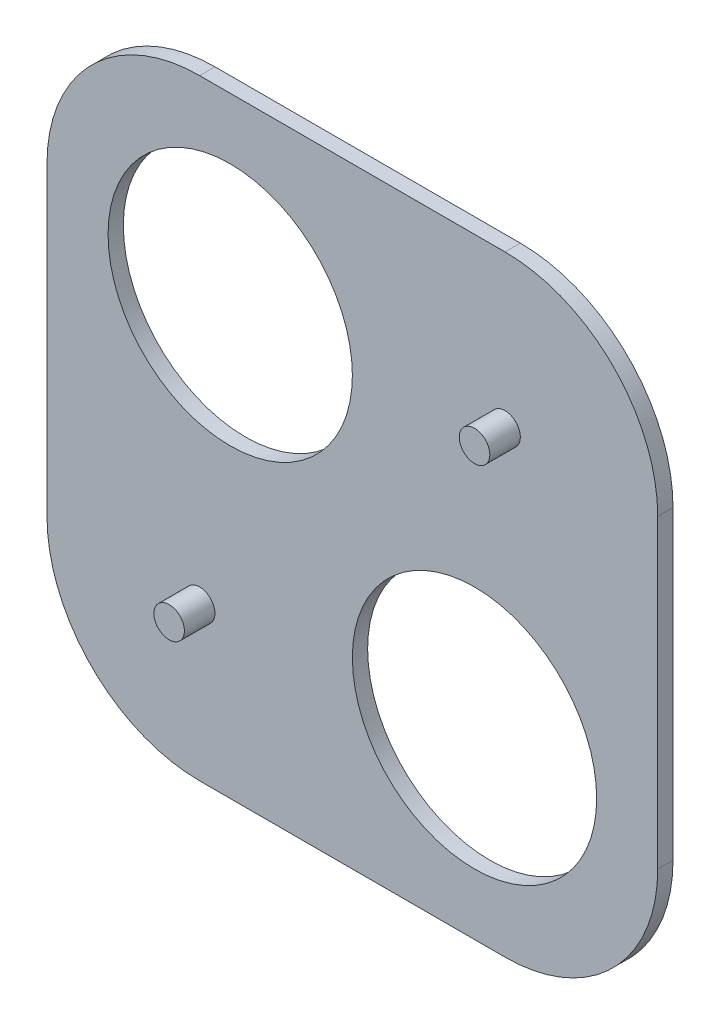
ISO-10303-21;
HEADER;
FILE_DESCRIPTION(('STEP AP214'),'2;1');
FILE_NAME('part.step','',(''),(''),'','','');
FILE_SCHEMA(('AUTOMOTIVE_DESIGN { 1 0 10303 214 1 1 1 1 }'));
ENDSEC;
DATA;
#1=APPLICATION_CONTEXT('core data for automotive mechanical design processes');
#2=APPLICATION_PROTOCOL_DEFINITION('international standard','automotive_design',2000,#1);
#3=PRODUCT_CONTEXT('',#1,'mechanical');
#4=PRODUCT('Part','Part','',(#3));
#5=PRODUCT_RELATED_PRODUCT_CATEGORY('part','',(#4));
#6=PRODUCT_DEFINITION_FORMATION('','',#4);
#7=PRODUCT_DEFINITION_CONTEXT('part definition',#1,'design');
#8=PRODUCT_DEFINITION('design','',#6,#7);
#9=PRODUCT_DEFINITION_SHAPE('','',#8);
#10=(LENGTH_UNIT() NAMED_UNIT(*) SI_UNIT(.MILLI.,.METRE.));
#11=(NAMED_UNIT(*) PLANE_ANGLE_UNIT() SI_UNIT($,.RADIAN.));
#12=(NAMED_UNIT(*) SI_UNIT($,.STERADIAN.) SOLID_ANGLE_UNIT());
#13=UNCERTAINTY_MEASURE_WITH_UNIT(LENGTH_MEASURE(1.E-05),#10,'distance_accuracy_value','');
#14=(GEOMETRIC_REPRESENTATION_CONTEXT(3) GLOBAL_UNCERTAINTY_ASSIGNED_CONTEXT((#13)) GLOBAL_UNIT_ASSIGNED_CONTEXT((#10,
#11,#12)) REPRESENTATION_CONTEXT('',''));
#15=CARTESIAN_POINT('',(0.,0.,0.));
#16=DIRECTION('',(0.,0.,1.));
#17=DIRECTION('',(1.,0.,0.));
#18=AXIS2_PLACEMENT_3D('',#15,#16,#17);
#19=CARTESIAN_POINT('',(-500.,-500.,50.));
#20=DIRECTION('',(0.,0.,-1.));
#21=DIRECTION('',(-1.,0.,0.));
#22=AXIS2_PLACEMENT_3D('',#19,#20,#21);
#23=CYLINDRICAL_SURFACE('',#22,500.);
#24=CARTESIAN_POINT('',(-500.,-500.,0.));
#25=DIRECTION('',(0.,0.,1.));
#26=DIRECTION('',(1.,0.,0.));
#27=AXIS2_PLACEMENT_3D('',#24,#25,#26);
#28=CIRCLE('',#27,500.);
#29=CARTESIAN_POINT('',(-1000.,-499.999999999996,0.));
#30=VERTEX_POINT('',#29);
#31=CARTESIAN_POINT('',(-499.999999999996,-1000.,0.));
#32=VERTEX_POINT('',#31);
#33=EDGE_CURVE('E141',#30,#32,#28,.T.);
#34=ORIENTED_EDGE('',*,*,#33,.T.);
#35=DIRECTION('',(0.,0.,-1.));
#36=VECTOR('',#35,1.);
#37=CARTESIAN_POINT('',(-499.999999999996,-1000.,50.));
#38=LINE('',#37,#36);
#39=CARTESIAN_POINT('',(-499.999999999996,-1000.,50.));
#40=VERTEX_POINT('',#39);
#41=EDGE_CURVE('E11',#40,#32,#38,.T.);
#42=ORIENTED_EDGE('',*,*,#41,.F.);
#43=CARTESIAN_POINT('',(-500.,-500.,50.));
#44=DIRECTION('',(0.,0.,1.));
#45=DIRECTION('',(1.,0.,0.));
#46=AXIS2_PLACEMENT_3D('',#43,#44,#45);
#47=CIRCLE('',#46,500.);
#48=CARTESIAN_POINT('',(-1000.,-499.999999999996,50.));
#49=VERTEX_POINT('',#48);
#50=EDGE_CURVE('E164',#49,#40,#47,.T.);
#51=ORIENTED_EDGE('',*,*,#50,.F.);
#52=DIRECTION('',(0.,0.,-1.));
#53=VECTOR('',#52,1.);
#54=CARTESIAN_POINT('',(-1000.,-499.999999999996,50.));
#55=LINE('',#54,#53);
#56=EDGE_CURVE('E137',#49,#30,#55,.T.);
#57=ORIENTED_EDGE('',*,*,#56,.T.);
#58=EDGE_LOOP('',(#34,#42,#51,#57));
#59=FACE_BOUND('',#58,.T.);
#60=ADVANCED_FACE('F38',(#59),#23,.T.);
#61=CARTESIAN_POINT('',(-499.999999999996,-1000.,50.));
#62=DIRECTION('',(0.,1.,0.));
#63=DIRECTION('',(0.,0.,1.));
#64=AXIS2_PLACEMENT_3D('',#61,#62,#63);
#65=PLANE('',#64);
#66=DIRECTION('',(1.,0.,0.));
#67=VECTOR('',#66,1.);
#68=CARTESIAN_POINT('',(-499.999999999996,-1000.,0.));
#69=LINE('',#68,#67);
#70=CARTESIAN_POINT('',(499.999999999996,-1000.,0.));
#71=VERTEX_POINT('',#70);
#72=EDGE_CURVE('E145',#32,#71,#69,.T.);
#73=ORIENTED_EDGE('',*,*,#72,.T.);
#74=DIRECTION('',(0.,0.,-1.));
#75=VECTOR('',#74,1.);
#76=CARTESIAN_POINT('',(499.999999999996,-1000.,50.));
#77=LINE('',#76,#75);
#78=CARTESIAN_POINT('',(499.999999999996,-1000.,50.));
#79=VERTEX_POINT('',#78);
#80=EDGE_CURVE('E48',#79,#71,#77,.T.);
#81=ORIENTED_EDGE('',*,*,#80,.F.);
#82=DIRECTION('',(1.,0.,0.));
#83=VECTOR('',#82,1.);
#84=CARTESIAN_POINT('',(-499.999999999996,-1000.,50.));
#85=LINE('',#84,#83);
#86=EDGE_CURVE('E100',#40,#79,#85,.T.);
#87=ORIENTED_EDGE('',*,*,#86,.F.);
#88=ORIENTED_EDGE('',*,*,#41,.T.);
#89=EDGE_LOOP('',(#73,#81,#87,#88));
#90=FACE_BOUND('',#89,.T.);
#91=ADVANCED_FACE('F254',(#90),#65,.F.);
#92=CARTESIAN_POINT('',(500.,-500.,50.));
#93=DIRECTION('',(0.,0.,-1.));
#94=DIRECTION('',(-1.,0.,0.));
#95=AXIS2_PLACEMENT_3D('',#92,#93,#94);
#96=CYLINDRICAL_SURFACE('',#95,500.);
#97=CARTESIAN_POINT('',(500.,-500.,0.));
#98=DIRECTION('',(0.,0.,1.));
#99=DIRECTION('',(-1.,0.,0.));
#100=AXIS2_PLACEMENT_3D('',#97,#98,#99);
#101=CIRCLE('',#100,500.);
#102=CARTESIAN_POINT('',(1000.,-499.999999999996,0.));
#103=VERTEX_POINT('',#102);
#104=EDGE_CURVE('E149',#71,#103,#101,.T.);
#105=ORIENTED_EDGE('',*,*,#104,.T.);
#106=DIRECTION('',(0.,0.,-1.));
#107=VECTOR('',#106,1.);
#108=CARTESIAN_POINT('',(1000.,-499.999999999996,50.));
#109=LINE('',#108,#107);
#110=CARTESIAN_POINT('',(1000.,-499.999999999996,50.));
#111=VERTEX_POINT('',#110);
#112=EDGE_CURVE('E175',#111,#103,#109,.T.);
#113=ORIENTED_EDGE('',*,*,#112,.F.);
#114=CARTESIAN_POINT('',(500.,-500.,50.));
#115=DIRECTION('',(0.,0.,1.));
#116=DIRECTION('',(-1.,0.,0.));
#117=AXIS2_PLACEMENT_3D('',#114,#115,#116);
#118=CIRCLE('',#117,500.);
#119=EDGE_CURVE('E218',#79,#111,#118,.T.);
#120=ORIENTED_EDGE('',*,*,#119,.F.);
#121=ORIENTED_EDGE('',*,*,#80,.T.);
#122=EDGE_LOOP('',(#105,#113,#120,#121));
#123=FACE_BOUND('',#122,.T.);
#124=ADVANCED_FACE('F258',(#123),#96,.T.);
#125=CARTESIAN_POINT('',(1000.,499.999999999996,50.));
#126=DIRECTION('',(-1.,0.,0.));
#127=DIRECTION('',(0.,-1.,0.));
#128=AXIS2_PLACEMENT_3D('',#125,#126,#127);
#129=PLANE('',#128);
#130=DIRECTION('',(0.,1.,0.));
#131=VECTOR('',#130,1.);
#132=CARTESIAN_POINT('',(1000.,499.999999999996,0.));
#133=LINE('',#132,#131);
#134=CARTESIAN_POINT('',(1000.,499.999999999997,0.));
#135=VERTEX_POINT('',#134);
#136=EDGE_CURVE('E152',#103,#135,#133,.T.);
#137=ORIENTED_EDGE('',*,*,#136,.T.);
#138=DIRECTION('',(0.,0.,-1.));
#139=VECTOR('',#138,1.);
#140=CARTESIAN_POINT('',(1000.,499.999999999997,50.));
#141=LINE('',#140,#139);
#142=CARTESIAN_POINT('',(1000.,499.999999999997,50.));
#143=VERTEX_POINT('',#142);
#144=EDGE_CURVE('E171',#143,#135,#141,.T.);
#145=ORIENTED_EDGE('',*,*,#144,.F.);
#146=DIRECTION('',(0.,1.,0.));
#147=VECTOR('',#146,1.);
#148=CARTESIAN_POINT('',(1000.,499.999999999996,50.));
#149=LINE('',#148,#147);
#150=EDGE_CURVE('E221',#111,#143,#149,.T.);
#151=ORIENTED_EDGE('',*,*,#150,.F.);
#152=ORIENTED_EDGE('',*,*,#112,.T.);
#153=EDGE_LOOP('',(#137,#145,#151,#152));
#154=FACE_BOUND('',#153,.T.);
#155=ADVANCED_FACE('F229',(#154),#129,.F.);
#156=CARTESIAN_POINT('',(500.,500.,50.));
#157=DIRECTION('',(0.,0.,-1.));
#158=DIRECTION('',(-1.,0.,0.));
#159=AXIS2_PLACEMENT_3D('',#156,#157,#158);
#160=CYLINDRICAL_SURFACE('',#159,500.);
#161=CARTESIAN_POINT('',(500.,500.,0.));
#162=DIRECTION('',(0.,0.,1.));
#163=DIRECTION('',(-1.,0.,0.));
#164=AXIS2_PLACEMENT_3D('',#161,#162,#163);
#165=CIRCLE('',#164,500.);
#166=CARTESIAN_POINT('',(499.999999999996,1000.,0.));
#167=VERTEX_POINT('',#166);
#168=EDGE_CURVE('E155',#135,#167,#165,.T.);
#169=ORIENTED_EDGE('',*,*,#168,.T.);
#170=DIRECTION('',(0.,0.,-1.));
#171=VECTOR('',#170,1.);
#172=CARTESIAN_POINT('',(499.999999999996,1000.,50.));
#173=LINE('',#172,#171);
#174=CARTESIAN_POINT('',(499.999999999996,1000.,50.));
#175=VERTEX_POINT('',#174);
#176=EDGE_CURVE('E130',#175,#167,#173,.T.);
#177=ORIENTED_EDGE('',*,*,#176,.F.);
#178=CARTESIAN_POINT('',(500.,500.,50.));
#179=DIRECTION('',(0.,0.,1.));
#180=DIRECTION('',(-1.,0.,0.));
#181=AXIS2_PLACEMENT_3D('',#178,#179,#180);
#182=CIRCLE('',#181,500.);
#183=EDGE_CURVE('E119',#143,#175,#182,.T.);
#184=ORIENTED_EDGE('',*,*,#183,.F.);
#185=ORIENTED_EDGE('',*,*,#144,.T.);
#186=EDGE_LOOP('',(#169,#177,#184,#185));
#187=FACE_BOUND('',#186,.T.);
#188=ADVANCED_FACE('F233',(#187),#160,.T.);
#189=CARTESIAN_POINT('',(-499.999999999996,1000.,50.));
#190=DIRECTION('',(0.,-1.,0.));
#191=DIRECTION('',(0.,0.,-1.));
#192=AXIS2_PLACEMENT_3D('',#189,#190,#191);
#193=PLANE('',#192);
#194=DIRECTION('',(-1.,0.,0.));
#195=VECTOR('',#194,1.);
#196=CARTESIAN_POINT('',(-499.999999999996,1000.,0.));
#197=LINE('',#196,#195);
#198=CARTESIAN_POINT('',(-499.999999999996,1000.,0.));
#199=VERTEX_POINT('',#198);
#200=EDGE_CURVE('E128',#167,#199,#197,.T.);
#201=ORIENTED_EDGE('',*,*,#200,.T.);
#202=DIRECTION('',(0.,0.,-1.));
#203=VECTOR('',#202,1.);
#204=CARTESIAN_POINT('',(-499.999999999996,1000.,50.));
#205=LINE('',#204,#203);
#206=CARTESIAN_POINT('',(-499.999999999996,1000.,50.));
#207=VERTEX_POINT('',#206);
#208=EDGE_CURVE('E125',#207,#199,#205,.T.);
#209=ORIENTED_EDGE('',*,*,#208,.F.);
#210=DIRECTION('',(-1.,0.,0.));
#211=VECTOR('',#210,1.);
#212=CARTESIAN_POINT('',(-499.999999999996,1000.,50.));
#213=LINE('',#212,#211);
#214=EDGE_CURVE('E113',#175,#207,#213,.T.);
#215=ORIENTED_EDGE('',*,*,#214,.F.);
#216=ORIENTED_EDGE('',*,*,#176,.T.);
#217=EDGE_LOOP('',(#201,#209,#215,#216));
#218=FACE_BOUND('',#217,.T.);
#219=ADVANCED_FACE('F126',(#218),#193,.F.);
#220=CARTESIAN_POINT('',(-500.,500.,50.));
#221=DIRECTION('',(0.,0.,-1.));
#222=DIRECTION('',(-1.,0.,0.));
#223=AXIS2_PLACEMENT_3D('',#220,#221,#222);
#224=CYLINDRICAL_SURFACE('',#223,500.);
#225=CARTESIAN_POINT('',(-500.,500.,0.));
#226=DIRECTION('',(0.,0.,1.));
#227=DIRECTION('',(-1.,0.,0.));
#228=AXIS2_PLACEMENT_3D('',#225,#226,#227);
#229=CIRCLE('',#228,500.);
#230=CARTESIAN_POINT('',(-1000.,499.999999999996,0.));
#231=VERTEX_POINT('',#230);
#232=EDGE_CURVE('E86',#199,#231,#229,.T.);
#233=ORIENTED_EDGE('',*,*,#232,.T.);
#234=DIRECTION('',(0.,0.,-1.));
#235=VECTOR('',#234,1.);
#236=CARTESIAN_POINT('',(-1000.,499.999999999996,50.));
#237=LINE('',#236,#235);
#238=CARTESIAN_POINT('',(-1000.,499.999999999996,50.));
#239=VERTEX_POINT('',#238);
#240=EDGE_CURVE('E131',#239,#231,#237,.T.);
#241=ORIENTED_EDGE('',*,*,#240,.F.);
#242=CARTESIAN_POINT('',(-500.,500.,50.));
#243=DIRECTION('',(0.,0.,1.));
#244=DIRECTION('',(-1.,0.,0.));
#245=AXIS2_PLACEMENT_3D('',#242,#243,#244);
#246=CIRCLE('',#245,500.);
#247=EDGE_CURVE('E117',#207,#239,#246,.T.);
#248=ORIENTED_EDGE('',*,*,#247,.F.);
#249=ORIENTED_EDGE('',*,*,#208,.T.);
#250=EDGE_LOOP('',(#233,#241,#248,#249));
#251=FACE_BOUND('',#250,.T.);
#252=ADVANCED_FACE('F133',(#251),#224,.T.);
#253=CARTESIAN_POINT('',(-1000.,499.999999999996,50.));
#254=DIRECTION('',(1.,0.,0.));
#255=DIRECTION('',(0.,1.,0.));
#256=AXIS2_PLACEMENT_3D('',#253,#254,#255);
#257=PLANE('',#256);
#258=DIRECTION('',(0.,-1.,0.));
#259=VECTOR('',#258,1.);
#260=CARTESIAN_POINT('',(-1000.,499.999999999996,0.));
#261=LINE('',#260,#259);
#262=EDGE_CURVE('E92',#231,#30,#261,.T.);
#263=ORIENTED_EDGE('',*,*,#262,.T.);
#264=ORIENTED_EDGE('',*,*,#56,.F.);
#265=DIRECTION('',(0.,-1.,0.));
#266=VECTOR('',#265,1.);
#267=CARTESIAN_POINT('',(-1000.,499.999999999996,50.));
#268=LINE('',#267,#266);
#269=EDGE_CURVE('E57',#239,#49,#268,.T.);
#270=ORIENTED_EDGE('',*,*,#269,.F.);
#271=ORIENTED_EDGE('',*,*,#240,.T.);
#272=EDGE_LOOP('',(#263,#264,#270,#271));
#273=FACE_BOUND('',#272,.T.);
#274=ADVANCED_FACE('F241',(#273),#257,.F.);
#275=CARTESIAN_POINT('',(-500.,-500.,50.));
#276=DIRECTION('',(0.,0.,1.));
#277=DIRECTION('',(1.,0.,0.));
#278=AXIS2_PLACEMENT_3D('',#275,#276,#277);
#279=PLANE('',#278);
#280=CARTESIAN_POINT('',(-400.,400.,50.));
#281=DIRECTION('',(0.,0.,1.));
#282=DIRECTION('',(1.,0.,0.));
#283=AXIS2_PLACEMENT_3D('',#280,#281,#282);
#284=CIRCLE('',#283,400.);
#285=CARTESIAN_POINT('',(0.,400.,50.));
#286=VERTEX_POINT('',#285);
#287=EDGE_CURVE('E192',#286,#286,#284,.T.);
#288=ORIENTED_EDGE('',*,*,#287,.F.);
#289=EDGE_LOOP('',(#288));
#290=FACE_BOUND('',#289,.T.);
#291=CARTESIAN_POINT('',(400.,-400.,50.));
#292=DIRECTION('',(0.,0.,1.));
#293=DIRECTION('',(1.,0.,0.));
#294=AXIS2_PLACEMENT_3D('',#291,#292,#293);
#295=CIRCLE('',#294,400.);
#296=CARTESIAN_POINT('',(800.,-400.,50.));
#297=VERTEX_POINT('',#296);
#298=EDGE_CURVE('E184',#297,#297,#295,.T.);
#299=ORIENTED_EDGE('',*,*,#298,.F.);
#300=EDGE_LOOP('',(#299));
#301=FACE_BOUND('',#300,.T.);
#302=CARTESIAN_POINT('',(500.,500.,50.));
#303=DIRECTION('',(0.,0.,1.));
#304=DIRECTION('',(1.,0.,0.));
#305=AXIS2_PLACEMENT_3D('',#302,#303,#304);
#306=CIRCLE('',#305,50.);
#307=CARTESIAN_POINT('',(450.,500.,50.));
#308=VERTEX_POINT('',#307);
#309=EDGE_CURVE('E190',#308,#308,#306,.T.);
#310=ORIENTED_EDGE('',*,*,#309,.F.);
#311=EDGE_LOOP('',(#310));
#312=FACE_BOUND('',#311,.T.);
#313=CARTESIAN_POINT('',(-500.,-500.,50.));
#314=DIRECTION('',(0.,0.,1.));
#315=DIRECTION('',(1.,0.,0.));
#316=AXIS2_PLACEMENT_3D('',#313,#314,#315);
#317=CIRCLE('',#316,50.);
#318=CARTESIAN_POINT('',(-550.,-500.,50.));
#319=VERTEX_POINT('',#318);
#320=EDGE_CURVE('E204',#319,#319,#317,.T.);
#321=ORIENTED_EDGE('',*,*,#320,.F.);
#322=EDGE_LOOP('',(#321));
#323=FACE_BOUND('',#322,.T.);
#324=ORIENTED_EDGE('',*,*,#50,.T.);
#325=ORIENTED_EDGE('',*,*,#86,.T.);
#326=ORIENTED_EDGE('',*,*,#119,.T.);
#327=ORIENTED_EDGE('',*,*,#150,.T.);
#328=ORIENTED_EDGE('',*,*,#183,.T.);
#329=ORIENTED_EDGE('',*,*,#214,.T.);
#330=ORIENTED_EDGE('',*,*,#247,.T.);
#331=ORIENTED_EDGE('',*,*,#269,.T.);
#332=EDGE_LOOP('',(#324,#325,#326,#327,#328,#329,#330,#331));
#333=FACE_BOUND('',#332,.T.);
#334=ADVANCED_FACE('F115',(#290,#301,#312,#323,#333),#279,.T.);
#335=CARTESIAN_POINT('',(-500.,-500.,0.));
#336=DIRECTION('',(0.,0.,1.));
#337=DIRECTION('',(1.,0.,0.));
#338=AXIS2_PLACEMENT_3D('',#335,#336,#337);
#339=PLANE('',#338);
#340=CARTESIAN_POINT('',(-400.,400.,0.));
#341=DIRECTION('',(0.,0.,1.));
#342=DIRECTION('',(1.,0.,0.));
#343=AXIS2_PLACEMENT_3D('',#340,#341,#342);
#344=CIRCLE('',#343,400.);
#345=CARTESIAN_POINT('',(0.,400.,0.));
#346=VERTEX_POINT('',#345);
#347=EDGE_CURVE('E41',#346,#346,#344,.T.);
#348=ORIENTED_EDGE('',*,*,#347,.T.);
#349=EDGE_LOOP('',(#348));
#350=FACE_BOUND('',#349,.T.);
#351=CARTESIAN_POINT('',(400.,-400.,0.));
#352=DIRECTION('',(0.,0.,1.));
#353=DIRECTION('',(1.,0.,0.));
#354=AXIS2_PLACEMENT_3D('',#351,#352,#353);
#355=CIRCLE('',#354,400.);
#356=CARTESIAN_POINT('',(800.,-400.,0.));
#357=VERTEX_POINT('',#356);
#358=EDGE_CURVE('E181',#357,#357,#355,.T.);
#359=ORIENTED_EDGE('',*,*,#358,.T.);
#360=EDGE_LOOP('',(#359));
#361=FACE_BOUND('',#360,.T.);
#362=ORIENTED_EDGE('',*,*,#33,.F.);
#363=ORIENTED_EDGE('',*,*,#262,.F.);
#364=ORIENTED_EDGE('',*,*,#232,.F.);
#365=ORIENTED_EDGE('',*,*,#200,.F.);
#366=ORIENTED_EDGE('',*,*,#168,.F.);
#367=ORIENTED_EDGE('',*,*,#136,.F.);
#368=ORIENTED_EDGE('',*,*,#104,.F.);
#369=ORIENTED_EDGE('',*,*,#72,.F.);
#370=EDGE_LOOP('',(#362,#363,#364,#365,#366,#367,#368,#369));
#371=FACE_BOUND('',#370,.T.);
#372=ADVANCED_FACE('F236',(#350,#361,#371),#339,.F.);
#373=CARTESIAN_POINT('',(-500.,-500.,150.));
#374=DIRECTION('',(0.,0.,-1.));
#375=DIRECTION('',(-1.,0.,0.));
#376=AXIS2_PLACEMENT_3D('',#373,#374,#375);
#377=CYLINDRICAL_SURFACE('',#376,50.);
#378=CARTESIAN_POINT('',(-500.,-500.,150.));
#379=DIRECTION('',(0.,0.,1.));
#380=DIRECTION('',(1.,0.,0.));
#381=AXIS2_PLACEMENT_3D('',#378,#379,#380);
#382=CIRCLE('',#381,50.);
#383=CARTESIAN_POINT('',(-550.,-500.,150.));
#384=VERTEX_POINT('',#383);
#385=EDGE_CURVE('E146',#384,#384,#382,.T.);
#386=CARTESIAN_POINT('',(-550.,-500.,150.));
#387=CARTESIAN_POINT('',(-550.,-500.,148.958333333333));
#388=CARTESIAN_POINT('',(-550.,-500.,147.916666666667));
#389=CARTESIAN_POINT('',(-550.,-500.,145.833333333333));
#390=CARTESIAN_POINT('',(-550.,-500.,144.791666666667));
#391=CARTESIAN_POINT('',(-550.,-500.,142.708333333333));
#392=CARTESIAN_POINT('',(-550.,-500.,141.666666666667));
#393=CARTESIAN_POINT('',(-550.,-500.,139.583333333333));
#394=CARTESIAN_POINT('',(-550.,-500.,138.541666666667));
#395=CARTESIAN_POINT('',(-550.,-500.,136.458333333333));
#396=CARTESIAN_POINT('',(-550.,-500.,135.416666666667));
#397=CARTESIAN_POINT('',(-550.,-500.,133.333333333333));
#398=CARTESIAN_POINT('',(-550.,-500.,132.291666666667));
#399=CARTESIAN_POINT('',(-550.,-500.,130.208333333333));
#400=CARTESIAN_POINT('',(-550.,-500.,129.166666666667));
#401=CARTESIAN_POINT('',(-550.,-500.,127.083333333333));
#402=CARTESIAN_POINT('',(-550.,-500.,126.041666666667));
#403=CARTESIAN_POINT('',(-550.,-500.,123.958333333333));
#404=CARTESIAN_POINT('',(-550.,-500.,122.916666666667));
#405=CARTESIAN_POINT('',(-550.,-500.,120.833333333333));
#406=CARTESIAN_POINT('',(-550.,-500.,119.791666666667));
#407=CARTESIAN_POINT('',(-550.,-500.,117.708333333333));
#408=CARTESIAN_POINT('',(-550.,-500.,116.666666666667));
#409=CARTESIAN_POINT('',(-550.,-500.,114.583333333333));
#410=CARTESIAN_POINT('',(-550.,-500.,113.541666666667));
#411=CARTESIAN_POINT('',(-550.,-500.,111.458333333333));
#412=CARTESIAN_POINT('',(-550.,-500.,110.416666666667));
#413=CARTESIAN_POINT('',(-550.,-500.,108.333333333333));
#414=CARTESIAN_POINT('',(-550.,-500.,107.291666666667));
#415=CARTESIAN_POINT('',(-550.,-500.,105.208333333333));
#416=CARTESIAN_POINT('',(-550.,-500.,104.166666666667));
#417=CARTESIAN_POINT('',(-550.,-500.,102.083333333333));
#418=CARTESIAN_POINT('',(-550.,-500.,101.041666666667));
#419=CARTESIAN_POINT('',(-550.,-500.,98.9583333333333));
#420=CARTESIAN_POINT('',(-550.,-500.,97.9166666666667));
#421=CARTESIAN_POINT('',(-550.,-500.,95.8333333333333));
#422=CARTESIAN_POINT('',(-550.,-500.,94.7916666666667));
#423=CARTESIAN_POINT('',(-550.,-500.,92.7083333333333));
#424=CARTESIAN_POINT('',(-550.,-500.,91.6666666666667));
#425=CARTESIAN_POINT('',(-550.,-500.,89.5833333333333));
#426=CARTESIAN_POINT('',(-550.,-500.,88.5416666666667));
#427=CARTESIAN_POINT('',(-550.,-500.,86.4583333333333));
#428=CARTESIAN_POINT('',(-550.,-500.,85.4166666666667));
#429=CARTESIAN_POINT('',(-550.,-500.,83.3333333333333));
#430=CARTESIAN_POINT('',(-550.,-500.,82.2916666666667));
#431=CARTESIAN_POINT('',(-550.,-500.,80.2083333333333));
#432=CARTESIAN_POINT('',(-550.,-500.,79.1666666666667));
#433=CARTESIAN_POINT('',(-550.,-500.,77.0833333333333));
#434=CARTESIAN_POINT('',(-550.,-500.,76.0416666666667));
#435=CARTESIAN_POINT('',(-550.,-500.,73.9583333333333));
#436=CARTESIAN_POINT('',(-550.,-500.,72.9166666666667));
#437=CARTESIAN_POINT('',(-550.,-500.,70.8333333333333));
#438=CARTESIAN_POINT('',(-550.,-500.,69.7916666666667));
#439=CARTESIAN_POINT('',(-550.,-500.,67.7083333333333));
#440=CARTESIAN_POINT('',(-550.,-500.,66.6666666666667));
#441=CARTESIAN_POINT('',(-550.,-500.,64.5833333333333));
#442=CARTESIAN_POINT('',(-550.,-500.,63.5416666666667));
#443=CARTESIAN_POINT('',(-550.,-500.,61.4583333333333));
#444=CARTESIAN_POINT('',(-550.,-500.,60.4166666666667));
#445=CARTESIAN_POINT('',(-550.,-500.,58.3333333333333));
#446=CARTESIAN_POINT('',(-550.,-500.,57.2916666666667));
#447=CARTESIAN_POINT('',(-550.,-500.,55.2083333333333));
#448=CARTESIAN_POINT('',(-550.,-500.,54.1666666666667));
#449=CARTESIAN_POINT('',(-550.,-500.,52.0833333333333));
#450=CARTESIAN_POINT('',(-550.,-500.,51.0416666666667));
#451=CARTESIAN_POINT('',(-550.,-500.,50.));
#452=B_SPLINE_CURVE_WITH_KNOTS('',3,(#386,#387,#388,#389,#390,#391,#392,#393,#394,#395,#396,
#397,#398,#399,#400,#401,#402,#403,#404,#405,#406,#407,#408,#409,#410,#411,#412,#413,#414,#415,
#416,#417,#418,#419,#420,#421,#422,#423,#424,#425,#426,#427,#428,#429,#430,#431,#432,#433,#434,
#435,#436,#437,#438,#439,#440,#441,#442,#443,#444,#445,#446,#447,#448,#449,#450,#451),
.UNSPECIFIED.,.F.,.F.,(4,2,2,2,2,2,2,2,2,2,2,2,2,2,2,2,2,2,2,2,2,2,2,2,2,2,2,2,2,2,2,2,4),(0.,
3.12499999999999,6.24999999999998,9.37499999999999,12.5,15.625,18.75,21.875,25.,28.125,31.25,
34.375,37.5,40.625,43.75,46.875,50.,53.125,56.25,59.375,62.5,65.625,68.75,71.875,75.,78.125,
81.25,84.375,87.5,90.625,93.75,96.875,100.),.UNSPECIFIED.);
#453=EDGE_CURVE('BSEAM288',#384,#319,#452,.T.);
#454=ORIENTED_EDGE('',*,*,#385,.F.);
#455=ORIENTED_EDGE('',*,*,#320,.T.);
#456=ORIENTED_EDGE('',*,*,#453,.T.);
#457=ORIENTED_EDGE('',*,*,#453,.F.);
#458=EDGE_LOOP('',(#454,#456,#455,#457));
#459=FACE_BOUND('',#458,.T.);
#460=ADVANCED_FACE('F288',(#459),#377,.T.);
#461=CARTESIAN_POINT('',(-500.,-500.,150.));
#462=DIRECTION('',(0.,0.,1.));
#463=DIRECTION('',(1.,0.,0.));
#464=AXIS2_PLACEMENT_3D('',#461,#462,#463);
#465=PLANE('',#464);
#466=ORIENTED_EDGE('',*,*,#385,.T.);
#467=EDGE_LOOP('',(#466));
#468=FACE_BOUND('',#467,.T.);
#469=ADVANCED_FACE('F293',(#468),#465,.T.);
#470=CARTESIAN_POINT('',(500.,500.,150.));
#471=DIRECTION('',(0.,0.,-1.));
#472=DIRECTION('',(-1.,0.,0.));
#473=AXIS2_PLACEMENT_3D('',#470,#471,#472);
#474=CYLINDRICAL_SURFACE('',#473,50.);
#475=CARTESIAN_POINT('',(500.,500.,150.));
#476=DIRECTION('',(0.,0.,1.));
#477=DIRECTION('',(1.,0.,0.));
#478=AXIS2_PLACEMENT_3D('',#475,#476,#477);
#479=CIRCLE('',#478,50.);
#480=CARTESIAN_POINT('',(450.,500.,150.));
#481=VERTEX_POINT('',#480);
#482=EDGE_CURVE('E200',#481,#481,#479,.T.);
#483=CARTESIAN_POINT('',(450.,500.,150.));
#484=CARTESIAN_POINT('',(450.,500.,148.958333333333));
#485=CARTESIAN_POINT('',(450.,500.,147.916666666667));
#486=CARTESIAN_POINT('',(450.,500.,145.833333333333));
#487=CARTESIAN_POINT('',(450.,500.,144.791666666667));
#488=CARTESIAN_POINT('',(450.,500.,142.708333333333));
#489=CARTESIAN_POINT('',(450.,500.,141.666666666667));
#490=CARTESIAN_POINT('',(450.,500.,139.583333333333));
#491=CARTESIAN_POINT('',(450.,500.,138.541666666667));
#492=CARTESIAN_POINT('',(450.,500.,136.458333333333));
#493=CARTESIAN_POINT('',(450.,500.,135.416666666667));
#494=CARTESIAN_POINT('',(450.,500.,133.333333333333));
#495=CARTESIAN_POINT('',(450.,500.,132.291666666667));
#496=CARTESIAN_POINT('',(450.,500.,130.208333333333));
#497=CARTESIAN_POINT('',(450.,500.,129.166666666667));
#498=CARTESIAN_POINT('',(450.,500.,127.083333333333));
#499=CARTESIAN_POINT('',(450.,500.,126.041666666667));
#500=CARTESIAN_POINT('',(450.,500.,123.958333333333));
#501=CARTESIAN_POINT('',(450.,500.,122.916666666667));
#502=CARTESIAN_POINT('',(450.,500.,120.833333333333));
#503=CARTESIAN_POINT('',(450.,500.,119.791666666667));
#504=CARTESIAN_POINT('',(450.,500.,117.708333333333));
#505=CARTESIAN_POINT('',(450.,500.,116.666666666667));
#506=CARTESIAN_POINT('',(450.,500.,114.583333333333));
#507=CARTESIAN_POINT('',(450.,500.,113.541666666667));
#508=CARTESIAN_POINT('',(450.,500.,111.458333333333));
#509=CARTESIAN_POINT('',(450.,500.,110.416666666667));
#510=CARTESIAN_POINT('',(450.,500.,108.333333333333));
#511=CARTESIAN_POINT('',(450.,500.,107.291666666667));
#512=CARTESIAN_POINT('',(450.,500.,105.208333333333));
#513=CARTESIAN_POINT('',(450.,500.,104.166666666667));
#514=CARTESIAN_POINT('',(450.,500.,102.083333333333));
#515=CARTESIAN_POINT('',(450.,500.,101.041666666667));
#516=CARTESIAN_POINT('',(450.,500.,98.9583333333333));
#517=CARTESIAN_POINT('',(450.,500.,97.9166666666667));
#518=CARTESIAN_POINT('',(450.,500.,95.8333333333333));
#519=CARTESIAN_POINT('',(450.,500.,94.7916666666667));
#520=CARTESIAN_POINT('',(450.,500.,92.7083333333333));
#521=CARTESIAN_POINT('',(450.,500.,91.6666666666667));
#522=CARTESIAN_POINT('',(450.,500.,89.5833333333333));
#523=CARTESIAN_POINT('',(450.,500.,88.5416666666667));
#524=CARTESIAN_POINT('',(450.,500.,86.4583333333333));
#525=CARTESIAN_POINT('',(450.,500.,85.4166666666667));
#526=CARTESIAN_POINT('',(450.,500.,83.3333333333333));
#527=CARTESIAN_POINT('',(450.,500.,82.2916666666667));
#528=CARTESIAN_POINT('',(450.,500.,80.2083333333333));
#529=CARTESIAN_POINT('',(450.,500.,79.1666666666667));
#530=CARTESIAN_POINT('',(450.,500.,77.0833333333333));
#531=CARTESIAN_POINT('',(450.,500.,76.0416666666667));
#532=CARTESIAN_POINT('',(450.,500.,73.9583333333333));
#533=CARTESIAN_POINT('',(450.,500.,72.9166666666667));
#534=CARTESIAN_POINT('',(450.,500.,70.8333333333333));
#535=CARTESIAN_POINT('',(450.,500.,69.7916666666667));
#536=CARTESIAN_POINT('',(450.,500.,67.7083333333333));
#537=CARTESIAN_POINT('',(450.,500.,66.6666666666667));
#538=CARTESIAN_POINT('',(450.,500.,64.5833333333333));
#539=CARTESIAN_POINT('',(450.,500.,63.5416666666667));
#540=CARTESIAN_POINT('',(450.,500.,61.4583333333333));
#541=CARTESIAN_POINT('',(450.,500.,60.4166666666667));
#542=CARTESIAN_POINT('',(450.,500.,58.3333333333333));
#543=CARTESIAN_POINT('',(450.,500.,57.2916666666667));
#544=CARTESIAN_POINT('',(450.,500.,55.2083333333333));
#545=CARTESIAN_POINT('',(450.,500.,54.1666666666667));
#546=CARTESIAN_POINT('',(450.,500.,52.0833333333333));
#547=CARTESIAN_POINT('',(450.,500.,51.0416666666667));
#548=CARTESIAN_POINT('',(450.,500.,50.));
#549=B_SPLINE_CURVE_WITH_KNOTS('',3,(#483,#484,#485,#486,#487,#488,#489,#490,#491,#492,#493,
#494,#495,#496,#497,#498,#499,#500,#501,#502,#503,#504,#505,#506,#507,#508,#509,#510,#511,#512,
#513,#514,#515,#516,#517,#518,#519,#520,#521,#522,#523,#524,#525,#526,#527,#528,#529,#530,#531,
#532,#533,#534,#535,#536,#537,#538,#539,#540,#541,#542,#543,#544,#545,#546,#547,#548),
.UNSPECIFIED.,.F.,.F.,(4,2,2,2,2,2,2,2,2,2,2,2,2,2,2,2,2,2,2,2,2,2,2,2,2,2,2,2,2,2,2,2,4),(0.,
3.12499999999999,6.24999999999998,9.37499999999999,12.5,15.625,18.75,21.875,25.,28.125,31.25,
34.375,37.5,40.625,43.75,46.875,50.,53.125,56.25,59.375,62.5,65.625,68.75,71.875,75.,78.125,
81.25,84.375,87.5,90.625,93.75,96.875,100.),.UNSPECIFIED.);
#550=EDGE_CURVE('BSEAM305',#481,#308,#549,.T.);
#551=ORIENTED_EDGE('',*,*,#482,.F.);
#552=ORIENTED_EDGE('',*,*,#309,.T.);
#553=ORIENTED_EDGE('',*,*,#550,.T.);
#554=ORIENTED_EDGE('',*,*,#550,.F.);
#555=EDGE_LOOP('',(#551,#553,#552,#554));
#556=FACE_BOUND('',#555,.T.);
#557=ADVANCED_FACE('F305',(#556),#474,.T.);
#558=CARTESIAN_POINT('',(500.,500.,150.));
#559=DIRECTION('',(0.,0.,1.));
#560=DIRECTION('',(1.,0.,0.));
#561=AXIS2_PLACEMENT_3D('',#558,#559,#560);
#562=PLANE('',#561);
#563=ORIENTED_EDGE('',*,*,#482,.T.);
#564=EDGE_LOOP('',(#563));
#565=FACE_BOUND('',#564,.T.);
#566=ADVANCED_FACE('F315',(#565),#562,.T.);
#567=CARTESIAN_POINT('',(400.,-400.,-50.));
#568=DIRECTION('',(0.,0.,1.));
#569=DIRECTION('',(1.,0.,0.));
#570=AXIS2_PLACEMENT_3D('',#567,#568,#569);
#571=CYLINDRICAL_SURFACE('',#570,400.);
#572=CARTESIAN_POINT('',(800.,-400.,50.));
#573=CARTESIAN_POINT('',(800.,-400.,49.4791666666667));
#574=CARTESIAN_POINT('',(800.,-400.,48.9583333333333));
#575=CARTESIAN_POINT('',(800.,-400.,47.9166666666667));
#576=CARTESIAN_POINT('',(800.,-400.,47.3958333333333));
#577=CARTESIAN_POINT('',(800.,-400.,46.3541666666667));
#578=CARTESIAN_POINT('',(800.,-400.,45.8333333333333));
#579=CARTESIAN_POINT('',(800.,-400.,44.7916666666667));
#580=CARTESIAN_POINT('',(800.,-400.,44.2708333333333));
#581=CARTESIAN_POINT('',(800.,-400.,43.2291666666667));
#582=CARTESIAN_POINT('',(800.,-400.,42.7083333333333));
#583=CARTESIAN_POINT('',(800.,-400.,41.6666666666667));
#584=CARTESIAN_POINT('',(800.,-400.,41.1458333333333));
#585=CARTESIAN_POINT('',(800.,-400.,40.1041666666667));
#586=CARTESIAN_POINT('',(800.,-400.,39.5833333333333));
#587=CARTESIAN_POINT('',(800.,-400.,38.5416666666667));
#588=CARTESIAN_POINT('',(800.,-400.,38.0208333333333));
#589=CARTESIAN_POINT('',(800.,-400.,36.9791666666667));
#590=CARTESIAN_POINT('',(800.,-400.,36.4583333333333));
#591=CARTESIAN_POINT('',(800.,-400.,35.4166666666667));
#592=CARTESIAN_POINT('',(800.,-400.,34.8958333333333));
#593=CARTESIAN_POINT('',(800.,-400.,33.8541666666667));
#594=CARTESIAN_POINT('',(800.,-400.,33.3333333333333));
#595=CARTESIAN_POINT('',(800.,-400.,32.2916666666667));
#596=CARTESIAN_POINT('',(800.,-400.,31.7708333333333));
#597=CARTESIAN_POINT('',(800.,-400.,30.7291666666667));
#598=CARTESIAN_POINT('',(800.,-400.,30.2083333333333));
#599=CARTESIAN_POINT('',(800.,-400.,29.1666666666667));
#600=CARTESIAN_POINT('',(800.,-400.,28.6458333333333));
#601=CARTESIAN_POINT('',(800.,-400.,27.6041666666667));
#602=CARTESIAN_POINT('',(800.,-400.,27.0833333333333));
#603=CARTESIAN_POINT('',(800.,-400.,26.0416666666667));
#604=CARTESIAN_POINT('',(800.,-400.,25.5208333333333));
#605=CARTESIAN_POINT('',(800.,-400.,24.4791666666667));
#606=CARTESIAN_POINT('',(800.,-400.,23.9583333333333));
#607=CARTESIAN_POINT('',(800.,-400.,22.9166666666667));
#608=CARTESIAN_POINT('',(800.,-400.,22.3958333333333));
#609=CARTESIAN_POINT('',(800.,-400.,21.3541666666667));
#610=CARTESIAN_POINT('',(800.,-400.,20.8333333333333));
#611=CARTESIAN_POINT('',(800.,-400.,19.7916666666667));
#612=CARTESIAN_POINT('',(800.,-400.,19.2708333333333));
#613=CARTESIAN_POINT('',(800.,-400.,18.2291666666667));
#614=CARTESIAN_POINT('',(800.,-400.,17.7083333333333));
#615=CARTESIAN_POINT('',(800.,-400.,16.6666666666667));
#616=CARTESIAN_POINT('',(800.,-400.,16.1458333333333));
#617=CARTESIAN_POINT('',(800.,-400.,15.1041666666667));
#618=CARTESIAN_POINT('',(800.,-400.,14.5833333333333));
#619=CARTESIAN_POINT('',(800.,-400.,13.5416666666667));
#620=CARTESIAN_POINT('',(800.,-400.,13.0208333333333));
#621=CARTESIAN_POINT('',(800.,-400.,11.9791666666667));
#622=CARTESIAN_POINT('',(800.,-400.,11.4583333333333));
#623=CARTESIAN_POINT('',(800.,-400.,10.4166666666667));
#624=CARTESIAN_POINT('',(800.,-400.,9.89583333333333));
#625=CARTESIAN_POINT('',(800.,-400.,8.85416666666666));
#626=CARTESIAN_POINT('',(800.,-400.,8.33333333333333));
#627=CARTESIAN_POINT('',(800.,-400.,7.29166666666666));
#628=CARTESIAN_POINT('',(800.,-400.,6.77083333333333));
#629=CARTESIAN_POINT('',(800.,-400.,5.72916666666666));
#630=CARTESIAN_POINT('',(800.,-400.,5.20833333333333));
#631=CARTESIAN_POINT('',(800.,-400.,4.16666666666666));
#632=CARTESIAN_POINT('',(800.,-400.,3.64583333333333));
#633=CARTESIAN_POINT('',(800.,-400.,2.60416666666666));
#634=CARTESIAN_POINT('',(800.,-400.,2.08333333333333));
#635=CARTESIAN_POINT('',(800.,-400.,1.04166666666666));
#636=CARTESIAN_POINT('',(800.,-400.,0.520833333333327));
#637=CARTESIAN_POINT('',(800.,-400.,0.));
#638=B_SPLINE_CURVE_WITH_KNOTS('',3,(#572,#573,#574,#575,#576,#577,#578,#579,#580,#581,#582,
#583,#584,#585,#586,#587,#588,#589,#590,#591,#592,#593,#594,#595,#596,#597,#598,#599,#600,#601,
#602,#603,#604,#605,#606,#607,#608,#609,#610,#611,#612,#613,#614,#615,#616,#617,#618,#619,#620,
#621,#622,#623,#624,#625,#626,#627,#628,#629,#630,#631,#632,#633,#634,#635,#636,#637),
.UNSPECIFIED.,.F.,.F.,(4,2,2,2,2,2,2,2,2,2,2,2,2,2,2,2,2,2,2,2,2,2,2,2,2,2,2,2,2,2,2,2,4),(0.,
1.56249999999999,3.125,4.6875,6.25000000000001,7.8125,9.37500000000001,10.9375,12.5,14.0625,
15.625,17.1875,18.75,20.3125,21.875,23.4375,25.,26.5625,28.125,29.6875,31.25,32.8125,34.375,
35.9375,37.5,39.0625,40.625,42.1875,43.75,45.3125,46.875,48.4375,50.),.UNSPECIFIED.);
#639=EDGE_CURVE('BSEAM324',#297,#357,#638,.T.);
#640=ORIENTED_EDGE('',*,*,#298,.T.);
#641=ORIENTED_EDGE('',*,*,#358,.F.);
#642=ORIENTED_EDGE('',*,*,#639,.T.);
#643=ORIENTED_EDGE('',*,*,#639,.F.);
#644=EDGE_LOOP('',(#640,#642,#641,#643));
#645=FACE_BOUND('',#644,.T.);
#646=ADVANCED_FACE('F324',(#645),#571,.F.);
#647=CARTESIAN_POINT('',(-400.,400.,-50.));
#648=DIRECTION('',(0.,0.,1.));
#649=DIRECTION('',(1.,0.,0.));
#650=AXIS2_PLACEMENT_3D('',#647,#648,#649);
#651=CYLINDRICAL_SURFACE('',#650,400.);
#652=CARTESIAN_POINT('',(0.,400.,50.));
#653=CARTESIAN_POINT('',(0.,400.,49.4791666666667));
#654=CARTESIAN_POINT('',(0.,400.,48.9583333333333));
#655=CARTESIAN_POINT('',(0.,400.,47.9166666666667));
#656=CARTESIAN_POINT('',(0.,400.,47.3958333333333));
#657=CARTESIAN_POINT('',(0.,400.,46.3541666666667));
#658=CARTESIAN_POINT('',(0.,400.,45.8333333333333));
#659=CARTESIAN_POINT('',(0.,400.,44.7916666666667));
#660=CARTESIAN_POINT('',(0.,400.,44.2708333333333));
#661=CARTESIAN_POINT('',(0.,400.,43.2291666666667));
#662=CARTESIAN_POINT('',(0.,400.,42.7083333333333));
#663=CARTESIAN_POINT('',(0.,400.,41.6666666666667));
#664=CARTESIAN_POINT('',(0.,400.,41.1458333333333));
#665=CARTESIAN_POINT('',(0.,400.,40.1041666666667));
#666=CARTESIAN_POINT('',(0.,400.,39.5833333333333));
#667=CARTESIAN_POINT('',(0.,400.,38.5416666666667));
#668=CARTESIAN_POINT('',(0.,400.,38.0208333333333));
#669=CARTESIAN_POINT('',(0.,400.,36.9791666666667));
#670=CARTESIAN_POINT('',(0.,400.,36.4583333333333));
#671=CARTESIAN_POINT('',(0.,400.,35.4166666666667));
#672=CARTESIAN_POINT('',(0.,400.,34.8958333333333));
#673=CARTESIAN_POINT('',(0.,400.,33.8541666666667));
#674=CARTESIAN_POINT('',(0.,400.,33.3333333333333));
#675=CARTESIAN_POINT('',(0.,400.,32.2916666666667));
#676=CARTESIAN_POINT('',(0.,400.,31.7708333333333));
#677=CARTESIAN_POINT('',(0.,400.,30.7291666666667));
#678=CARTESIAN_POINT('',(0.,400.,30.2083333333333));
#679=CARTESIAN_POINT('',(0.,400.,29.1666666666667));
#680=CARTESIAN_POINT('',(0.,400.,28.6458333333333));
#681=CARTESIAN_POINT('',(0.,400.,27.6041666666667));
#682=CARTESIAN_POINT('',(0.,400.,27.0833333333333));
#683=CARTESIAN_POINT('',(0.,400.,26.0416666666667));
#684=CARTESIAN_POINT('',(0.,400.,25.5208333333333));
#685=CARTESIAN_POINT('',(0.,400.,24.4791666666667));
#686=CARTESIAN_POINT('',(0.,400.,23.9583333333333));
#687=CARTESIAN_POINT('',(0.,400.,22.9166666666667));
#688=CARTESIAN_POINT('',(0.,400.,22.3958333333333));
#689=CARTESIAN_POINT('',(0.,400.,21.3541666666667));
#690=CARTESIAN_POINT('',(0.,400.,20.8333333333333));
#691=CARTESIAN_POINT('',(0.,400.,19.7916666666667));
#692=CARTESIAN_POINT('',(0.,400.,19.2708333333333));
#693=CARTESIAN_POINT('',(0.,400.,18.2291666666667));
#694=CARTESIAN_POINT('',(0.,400.,17.7083333333333));
#695=CARTESIAN_POINT('',(0.,400.,16.6666666666667));
#696=CARTESIAN_POINT('',(0.,400.,16.1458333333333));
#697=CARTESIAN_POINT('',(0.,400.,15.1041666666667));
#698=CARTESIAN_POINT('',(0.,400.,14.5833333333333));
#699=CARTESIAN_POINT('',(0.,400.,13.5416666666667));
#700=CARTESIAN_POINT('',(0.,400.,13.0208333333333));
#701=CARTESIAN_POINT('',(0.,400.,11.9791666666667));
#702=CARTESIAN_POINT('',(0.,400.,11.4583333333333));
#703=CARTESIAN_POINT('',(0.,400.,10.4166666666667));
#704=CARTESIAN_POINT('',(0.,400.,9.89583333333333));
#705=CARTESIAN_POINT('',(0.,400.,8.85416666666666));
#706=CARTESIAN_POINT('',(0.,400.,8.33333333333333));
#707=CARTESIAN_POINT('',(0.,400.,7.29166666666666));
#708=CARTESIAN_POINT('',(0.,400.,6.77083333333333));
#709=CARTESIAN_POINT('',(0.,400.,5.72916666666666));
#710=CARTESIAN_POINT('',(0.,400.,5.20833333333333));
#711=CARTESIAN_POINT('',(0.,400.,4.16666666666666));
#712=CARTESIAN_POINT('',(0.,400.,3.64583333333333));
#713=CARTESIAN_POINT('',(0.,400.,2.60416666666666));
#714=CARTESIAN_POINT('',(0.,400.,2.08333333333333));
#715=CARTESIAN_POINT('',(0.,400.,1.04166666666666));
#716=CARTESIAN_POINT('',(0.,400.,0.520833333333327));
#717=CARTESIAN_POINT('',(0.,400.,0.));
#718=B_SPLINE_CURVE_WITH_KNOTS('',3,(#652,#653,#654,#655,#656,#657,#658,#659,#660,#661,#662,
#663,#664,#665,#666,#667,#668,#669,#670,#671,#672,#673,#674,#675,#676,#677,#678,#679,#680,#681,
#682,#683,#684,#685,#686,#687,#688,#689,#690,#691,#692,#693,#694,#695,#696,#697,#698,#699,#700,
#701,#702,#703,#704,#705,#706,#707,#708,#709,#710,#711,#712,#713,#714,#715,#716,#717),
.UNSPECIFIED.,.F.,.F.,(4,2,2,2,2,2,2,2,2,2,2,2,2,2,2,2,2,2,2,2,2,2,2,2,2,2,2,2,2,2,2,2,4),(0.,
1.56249999999999,3.125,4.6875,6.25000000000001,7.8125,9.37500000000001,10.9375,12.5,14.0625,
15.625,17.1875,18.75,20.3125,21.875,23.4375,25.,26.5625,28.125,29.6875,31.25,32.8125,34.375,
35.9375,37.5,39.0625,40.625,42.1875,43.75,45.3125,46.875,48.4375,50.),.UNSPECIFIED.);
#719=EDGE_CURVE('BSEAM341',#286,#346,#718,.T.);
#720=ORIENTED_EDGE('',*,*,#287,.T.);
#721=ORIENTED_EDGE('',*,*,#347,.F.);
#722=ORIENTED_EDGE('',*,*,#719,.T.);
#723=ORIENTED_EDGE('',*,*,#719,.F.);
#724=EDGE_LOOP('',(#720,#722,#721,#723));
#725=FACE_BOUND('',#724,.T.);
#726=ADVANCED_FACE('F341',(#725),#651,.F.);
#727=CLOSED_SHELL('',(#60,#91,#124,#155,#188,#219,#252,#274,#334,#372,#460,#469,#557,#566,#646,#726));
#728=MANIFOLD_SOLID_BREP('B2',#727);
#729=ADVANCED_BREP_SHAPE_REPRESENTATION('',(#18,#728),#14);
#730=SHAPE_DEFINITION_REPRESENTATION(#9,#729);
ENDSEC;
END-ISO-10303-21;
